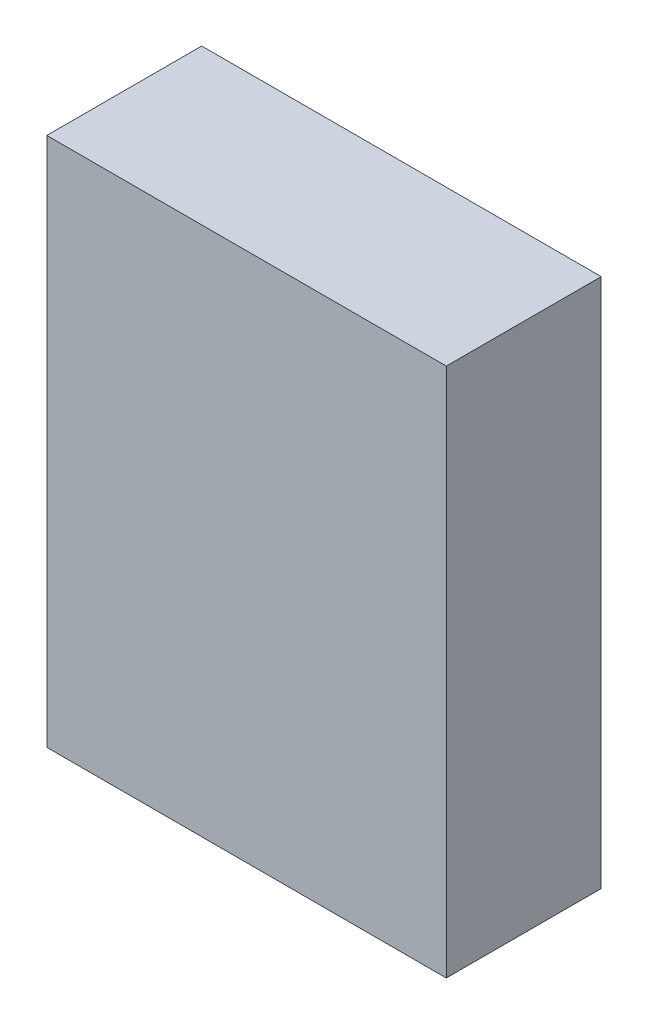
ISO-10303-21;
HEADER;
FILE_DESCRIPTION(('STEP AP214'),'2;1');
FILE_NAME('part.step','',(''),(''),'','','');
FILE_SCHEMA(('AUTOMOTIVE_DESIGN { 1 0 10303 214 1 1 1 1 }'));
ENDSEC;
DATA;
#1=APPLICATION_CONTEXT('core data for automotive mechanical design processes');
#2=APPLICATION_PROTOCOL_DEFINITION('international standard','automotive_design',2000,#1);
#3=PRODUCT_CONTEXT('',#1,'mechanical');
#4=PRODUCT('Part','Part','',(#3));
#5=PRODUCT_RELATED_PRODUCT_CATEGORY('part','',(#4));
#6=PRODUCT_DEFINITION_FORMATION('','',#4);
#7=PRODUCT_DEFINITION_CONTEXT('part definition',#1,'design');
#8=PRODUCT_DEFINITION('design','',#6,#7);
#9=PRODUCT_DEFINITION_SHAPE('','',#8);
#10=(LENGTH_UNIT() NAMED_UNIT(*) SI_UNIT(.MILLI.,.METRE.));
#11=(NAMED_UNIT(*) PLANE_ANGLE_UNIT() SI_UNIT($,.RADIAN.));
#12=(NAMED_UNIT(*) SI_UNIT($,.STERADIAN.) SOLID_ANGLE_UNIT());
#13=UNCERTAINTY_MEASURE_WITH_UNIT(LENGTH_MEASURE(1.E-05),#10,'distance_accuracy_value','');
#14=(GEOMETRIC_REPRESENTATION_CONTEXT(3) GLOBAL_UNCERTAINTY_ASSIGNED_CONTEXT((#13)) GLOBAL_UNIT_ASSIGNED_CONTEXT((#10,
#11,#12)) REPRESENTATION_CONTEXT('',''));
#15=CARTESIAN_POINT('',(0.,0.,0.));
#16=DIRECTION('',(0.,0.,1.));
#17=DIRECTION('',(1.,0.,0.));
#18=AXIS2_PLACEMENT_3D('',#15,#16,#17);
#19=CARTESIAN_POINT('',(-49.,130.,-19.));
#20=DIRECTION('',(1.,0.,0.));
#21=DIRECTION('',(0.,0.,-1.));
#22=AXIS2_PLACEMENT_3D('',#19,#20,#21);
#23=PLANE('',#22);
#24=DIRECTION('',(0.,0.,1.));
#25=VECTOR('',#24,1.);
#26=CARTESIAN_POINT('',(-49.,0.,-19.));
#27=LINE('',#26,#25);
#28=CARTESIAN_POINT('',(-49.,0.,-19.));
#29=VERTEX_POINT('',#28);
#30=CARTESIAN_POINT('',(-49.,0.,19.));
#31=VERTEX_POINT('',#30);
#32=EDGE_CURVE('E111',#29,#31,#27,.T.);
#33=ORIENTED_EDGE('',*,*,#32,.T.);
#34=DIRECTION('',(0.,-1.,0.));
#35=VECTOR('',#34,1.);
#36=CARTESIAN_POINT('',(-49.,130.,19.));
#37=LINE('',#36,#35);
#38=CARTESIAN_POINT('',(-49.,130.,19.));
#39=VERTEX_POINT('',#38);
#40=EDGE_CURVE('E11',#39,#31,#37,.T.);
#41=ORIENTED_EDGE('',*,*,#40,.F.);
#42=DIRECTION('',(0.,0.,1.));
#43=VECTOR('',#42,1.);
#44=CARTESIAN_POINT('',(-49.,130.,-19.));
#45=LINE('',#44,#43);
#46=CARTESIAN_POINT('',(-49.,130.,-19.));
#47=VERTEX_POINT('',#46);
#48=EDGE_CURVE('E95',#47,#39,#45,.T.);
#49=ORIENTED_EDGE('',*,*,#48,.F.);
#50=DIRECTION('',(0.,-1.,0.));
#51=VECTOR('',#50,1.);
#52=CARTESIAN_POINT('',(-49.,130.,-19.));
#53=LINE('',#52,#51);
#54=EDGE_CURVE('E107',#47,#29,#53,.T.);
#55=ORIENTED_EDGE('',*,*,#54,.T.);
#56=EDGE_LOOP('',(#33,#41,#49,#55));
#57=FACE_BOUND('',#56,.T.);
#58=ADVANCED_FACE('F43',(#57),#23,.F.);
#59=CARTESIAN_POINT('',(-49.,130.,19.));
#60=DIRECTION('',(0.,0.,-1.));
#61=DIRECTION('',(-1.,0.,0.));
#62=AXIS2_PLACEMENT_3D('',#59,#60,#61);
#63=PLANE('',#62);
#64=DIRECTION('',(1.,0.,0.));
#65=VECTOR('',#64,1.);
#66=CARTESIAN_POINT('',(-49.,0.,19.));
#67=LINE('',#66,#65);
#68=CARTESIAN_POINT('',(49.,0.,19.));
#69=VERTEX_POINT('',#68);
#70=EDGE_CURVE('E100',#31,#69,#67,.T.);
#71=ORIENTED_EDGE('',*,*,#70,.T.);
#72=DIRECTION('',(0.,-1.,0.));
#73=VECTOR('',#72,1.);
#74=CARTESIAN_POINT('',(49.,130.,19.));
#75=LINE('',#74,#73);
#76=CARTESIAN_POINT('',(49.,130.,19.));
#77=VERTEX_POINT('',#76);
#78=EDGE_CURVE('E52',#77,#69,#75,.T.);
#79=ORIENTED_EDGE('',*,*,#78,.F.);
#80=DIRECTION('',(1.,0.,0.));
#81=VECTOR('',#80,1.);
#82=CARTESIAN_POINT('',(-49.,130.,19.));
#83=LINE('',#82,#81);
#84=EDGE_CURVE('E90',#39,#77,#83,.T.);
#85=ORIENTED_EDGE('',*,*,#84,.F.);
#86=ORIENTED_EDGE('',*,*,#40,.T.);
#87=EDGE_LOOP('',(#71,#79,#85,#86));
#88=FACE_BOUND('',#87,.T.);
#89=ADVANCED_FACE('F99',(#88),#63,.F.);
#90=CARTESIAN_POINT('',(49.,130.,-19.));
#91=DIRECTION('',(-1.,0.,0.));
#92=DIRECTION('',(0.,0.,1.));
#93=AXIS2_PLACEMENT_3D('',#90,#91,#92);
#94=PLANE('',#93);
#95=DIRECTION('',(0.,0.,-1.));
#96=VECTOR('',#95,1.);
#97=CARTESIAN_POINT('',(49.,0.,-19.));
#98=LINE('',#97,#96);
#99=CARTESIAN_POINT('',(49.,0.,-19.));
#100=VERTEX_POINT('',#99);
#101=EDGE_CURVE('E77',#69,#100,#98,.T.);
#102=ORIENTED_EDGE('',*,*,#101,.T.);
#103=DIRECTION('',(0.,-1.,0.));
#104=VECTOR('',#103,1.);
#105=CARTESIAN_POINT('',(49.,130.,-19.));
#106=LINE('',#105,#104);
#107=CARTESIAN_POINT('',(49.,130.,-19.));
#108=VERTEX_POINT('',#107);
#109=EDGE_CURVE('E102',#108,#100,#106,.T.);
#110=ORIENTED_EDGE('',*,*,#109,.F.);
#111=DIRECTION('',(0.,0.,-1.));
#112=VECTOR('',#111,1.);
#113=CARTESIAN_POINT('',(49.,130.,-19.));
#114=LINE('',#113,#112);
#115=EDGE_CURVE('E93',#77,#108,#114,.T.);
#116=ORIENTED_EDGE('',*,*,#115,.F.);
#117=ORIENTED_EDGE('',*,*,#78,.T.);
#118=EDGE_LOOP('',(#102,#110,#116,#117));
#119=FACE_BOUND('',#118,.T.);
#120=ADVANCED_FACE('F103',(#119),#94,.F.);
#121=CARTESIAN_POINT('',(-49.,130.,-19.));
#122=DIRECTION('',(0.,0.,1.));
#123=DIRECTION('',(1.,0.,0.));
#124=AXIS2_PLACEMENT_3D('',#121,#122,#123);
#125=PLANE('',#124);
#126=DIRECTION('',(-1.,0.,0.));
#127=VECTOR('',#126,1.);
#128=CARTESIAN_POINT('',(-49.,0.,-19.));
#129=LINE('',#128,#127);
#130=EDGE_CURVE('E83',#100,#29,#129,.T.);
#131=ORIENTED_EDGE('',*,*,#130,.T.);
#132=ORIENTED_EDGE('',*,*,#54,.F.);
#133=DIRECTION('',(-1.,0.,0.));
#134=VECTOR('',#133,1.);
#135=CARTESIAN_POINT('',(-49.,130.,-19.));
#136=LINE('',#135,#134);
#137=EDGE_CURVE('E60',#108,#47,#136,.T.);
#138=ORIENTED_EDGE('',*,*,#137,.F.);
#139=ORIENTED_EDGE('',*,*,#109,.T.);
#140=EDGE_LOOP('',(#131,#132,#138,#139));
#141=FACE_BOUND('',#140,.T.);
#142=ADVANCED_FACE('F124',(#141),#125,.F.);
#143=CARTESIAN_POINT('',(0.,130.,0.));
#144=DIRECTION('',(0.,1.,0.));
#145=DIRECTION('',(0.,0.,1.));
#146=AXIS2_PLACEMENT_3D('',#143,#144,#145);
#147=PLANE('',#146);
#148=ORIENTED_EDGE('',*,*,#48,.T.);
#149=ORIENTED_EDGE('',*,*,#84,.T.);
#150=ORIENTED_EDGE('',*,*,#115,.T.);
#151=ORIENTED_EDGE('',*,*,#137,.T.);
#152=EDGE_LOOP('',(#148,#149,#150,#151));
#153=FACE_BOUND('',#152,.T.);
#154=ADVANCED_FACE('F91',(#153),#147,.T.);
#155=CARTESIAN_POINT('',(0.,0.,0.));
#156=DIRECTION('',(0.,1.,0.));
#157=DIRECTION('',(0.,0.,1.));
#158=AXIS2_PLACEMENT_3D('',#155,#156,#157);
#159=PLANE('',#158);
#160=ORIENTED_EDGE('',*,*,#32,.F.);
#161=ORIENTED_EDGE('',*,*,#130,.F.);
#162=ORIENTED_EDGE('',*,*,#101,.F.);
#163=ORIENTED_EDGE('',*,*,#70,.F.);
#164=EDGE_LOOP('',(#160,#161,#162,#163));
#165=FACE_BOUND('',#164,.T.);
#166=ADVANCED_FACE('F127',(#165),#159,.F.);
#167=CLOSED_SHELL('',(#58,#89,#120,#142,#154,#166));
#168=MANIFOLD_SOLID_BREP('B2',#167);
#169=ADVANCED_BREP_SHAPE_REPRESENTATION('',(#18,#168),#14);
#170=SHAPE_DEFINITION_REPRESENTATION(#9,#169);
ENDSEC;
END-ISO-10303-21;
